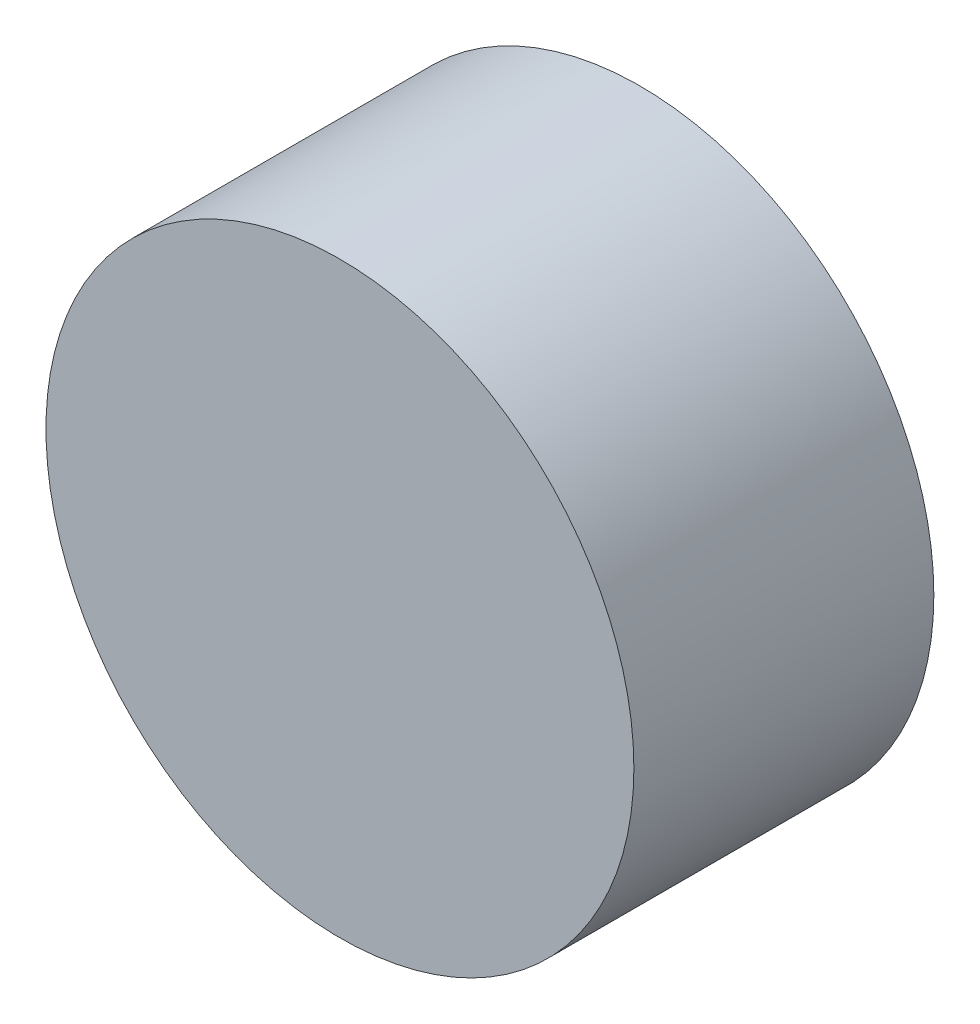
ISO-10303-21;
HEADER;
FILE_DESCRIPTION(('STEP AP214'),'2;1');
FILE_NAME('part.step','',(''),(''),'','','');
FILE_SCHEMA(('AUTOMOTIVE_DESIGN { 1 0 10303 214 1 1 1 1 }'));
ENDSEC;
DATA;
#1=APPLICATION_CONTEXT('core data for automotive mechanical design processes');
#2=APPLICATION_PROTOCOL_DEFINITION('international standard','automotive_design',2000,#1);
#3=PRODUCT_CONTEXT('',#1,'mechanical');
#4=PRODUCT('Part','Part','',(#3));
#5=PRODUCT_RELATED_PRODUCT_CATEGORY('part','',(#4));
#6=PRODUCT_DEFINITION_FORMATION('','',#4);
#7=PRODUCT_DEFINITION_CONTEXT('part definition',#1,'design');
#8=PRODUCT_DEFINITION('design','',#6,#7);
#9=PRODUCT_DEFINITION_SHAPE('','',#8);
#10=(LENGTH_UNIT() NAMED_UNIT(*) SI_UNIT(.MILLI.,.METRE.));
#11=(NAMED_UNIT(*) PLANE_ANGLE_UNIT() SI_UNIT($,.RADIAN.));
#12=(NAMED_UNIT(*) SI_UNIT($,.STERADIAN.) SOLID_ANGLE_UNIT());
#13=UNCERTAINTY_MEASURE_WITH_UNIT(LENGTH_MEASURE(1.E-05),#10,'distance_accuracy_value','');
#14=(GEOMETRIC_REPRESENTATION_CONTEXT(3) GLOBAL_UNCERTAINTY_ASSIGNED_CONTEXT((#13)) GLOBAL_UNIT_ASSIGNED_CONTEXT((#10,
#11,#12)) REPRESENTATION_CONTEXT('',''));
#15=CARTESIAN_POINT('',(0.,0.,0.));
#16=DIRECTION('',(0.,0.,1.));
#17=DIRECTION('',(1.,0.,0.));
#18=AXIS2_PLACEMENT_3D('',#15,#16,#17);
#19=CARTESIAN_POINT('',(0.,0.,0.));
#20=DIRECTION('',(0.,0.,1.));
#21=DIRECTION('',(1.,0.,0.));
#22=AXIS2_PLACEMENT_3D('',#19,#20,#21);
#23=PLANE('',#22);
#24=CARTESIAN_POINT('',(0.,0.,0.));
#25=DIRECTION('',(0.,0.,1.));
#26=DIRECTION('',(1.,0.,0.));
#27=AXIS2_PLACEMENT_3D('',#24,#25,#26);
#28=CIRCLE('',#27,12.25);
#29=CARTESIAN_POINT('',(12.25,0.,0.));
#30=VERTEX_POINT('',#29);
#31=EDGE_CURVE('E10',#30,#30,#28,.T.);
#32=ORIENTED_EDGE('',*,*,#31,.F.);
#33=EDGE_LOOP('',(#32));
#34=FACE_BOUND('',#33,.T.);
#35=CARTESIAN_POINT('',(0.,0.,0.));
#36=DIRECTION('',(0.,0.,1.));
#37=DIRECTION('',(1.,0.,0.));
#38=AXIS2_PLACEMENT_3D('',#35,#36,#37);
#39=CIRCLE('',#38,11.5);
#40=CARTESIAN_POINT('',(11.5,0.,0.));
#41=VERTEX_POINT('',#40);
#42=EDGE_CURVE('E38',#41,#41,#39,.T.);
#43=ORIENTED_EDGE('',*,*,#42,.T.);
#44=EDGE_LOOP('',(#43));
#45=FACE_BOUND('',#44,.T.);
#46=ADVANCED_FACE('F31',(#34,#45),#23,.F.);
#47=CARTESIAN_POINT('',(0.,0.,11.));
#48=DIRECTION('',(0.,0.,-1.));
#49=DIRECTION('',(-1.,0.,0.));
#50=AXIS2_PLACEMENT_3D('',#47,#48,#49);
#51=CYLINDRICAL_SURFACE('',#50,12.25);
#52=ORIENTED_EDGE('',*,*,#31,.T.);
#53=EDGE_LOOP('',(#52));
#54=FACE_BOUND('',#53,.T.);
#55=CARTESIAN_POINT('',(0.,0.,12.5));
#56=DIRECTION('',(0.,0.,1.));
#57=DIRECTION('',(1.,0.,0.));
#58=AXIS2_PLACEMENT_3D('',#55,#56,#57);
#59=CIRCLE('',#58,12.25);
#60=CARTESIAN_POINT('',(12.25,0.,12.5));
#61=VERTEX_POINT('',#60);
#62=EDGE_CURVE('E46',#61,#61,#59,.T.);
#63=ORIENTED_EDGE('',*,*,#62,.F.);
#64=EDGE_LOOP('',(#63));
#65=FACE_BOUND('',#64,.T.);
#66=ADVANCED_FACE('F33',(#54,#65),#51,.T.);
#67=CARTESIAN_POINT('',(0.,0.,11.));
#68=DIRECTION('',(0.,0.,-1.));
#69=DIRECTION('',(-1.,0.,0.));
#70=AXIS2_PLACEMENT_3D('',#67,#68,#69);
#71=CYLINDRICAL_SURFACE('',#70,11.5);
#72=CARTESIAN_POINT('',(0.,0.,11.));
#73=DIRECTION('',(0.,0.,1.));
#74=DIRECTION('',(1.,0.,0.));
#75=AXIS2_PLACEMENT_3D('',#72,#73,#74);
#76=CIRCLE('',#75,11.5);
#77=CARTESIAN_POINT('',(11.5,0.,11.));
#78=VERTEX_POINT('',#77);
#79=EDGE_CURVE('E42',#78,#78,#76,.T.);
#80=ORIENTED_EDGE('',*,*,#79,.T.);
#81=EDGE_LOOP('',(#80));
#82=FACE_BOUND('',#81,.T.);
#83=ORIENTED_EDGE('',*,*,#42,.F.);
#84=EDGE_LOOP('',(#83));
#85=FACE_BOUND('',#84,.T.);
#86=ADVANCED_FACE('F55',(#82,#85),#71,.F.);
#87=CARTESIAN_POINT('',(0.,0.,11.));
#88=DIRECTION('',(0.,0.,1.));
#89=DIRECTION('',(1.,0.,0.));
#90=AXIS2_PLACEMENT_3D('',#87,#88,#89);
#91=PLANE('',#90);
#92=ORIENTED_EDGE('',*,*,#79,.F.);
#93=EDGE_LOOP('',(#92));
#94=FACE_BOUND('',#93,.T.);
#95=ADVANCED_FACE('F60',(#94),#91,.F.);
#96=CARTESIAN_POINT('',(0.,0.,12.5));
#97=DIRECTION('',(0.,0.,1.));
#98=DIRECTION('',(1.,0.,0.));
#99=AXIS2_PLACEMENT_3D('',#96,#97,#98);
#100=PLANE('',#99);
#101=ORIENTED_EDGE('',*,*,#62,.T.);
#102=EDGE_LOOP('',(#101));
#103=FACE_BOUND('',#102,.T.);
#104=ADVANCED_FACE('F52',(#103),#100,.T.);
#105=CLOSED_SHELL('',(#46,#66,#86,#95,#104));
#106=MANIFOLD_SOLID_BREP('B2',#105);
#107=ADVANCED_BREP_SHAPE_REPRESENTATION('',(#18,#106),#14);
#108=SHAPE_DEFINITION_REPRESENTATION(#9,#107);
ENDSEC;
END-ISO-10303-21;
